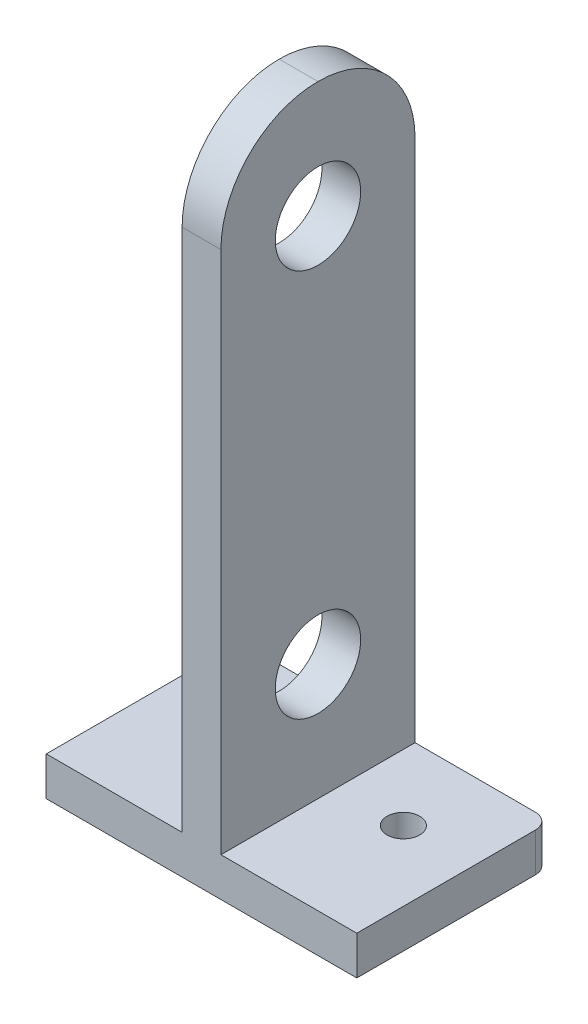
ISO-10303-21;
HEADER;
FILE_DESCRIPTION(('STEP AP214'),'2;1');
FILE_NAME('part.step','',(''),(''),'','','');
FILE_SCHEMA(('AUTOMOTIVE_DESIGN { 1 0 10303 214 1 1 1 1 }'));
ENDSEC;
DATA;
#1=APPLICATION_CONTEXT('core data for automotive mechanical design processes');
#2=APPLICATION_PROTOCOL_DEFINITION('international standard','automotive_design',2000,#1);
#3=PRODUCT_CONTEXT('',#1,'mechanical');
#4=PRODUCT('Part','Part','',(#3));
#5=PRODUCT_RELATED_PRODUCT_CATEGORY('part','',(#4));
#6=PRODUCT_DEFINITION_FORMATION('','',#4);
#7=PRODUCT_DEFINITION_CONTEXT('part definition',#1,'design');
#8=PRODUCT_DEFINITION('design','',#6,#7);
#9=PRODUCT_DEFINITION_SHAPE('','',#8);
#10=(LENGTH_UNIT() NAMED_UNIT(*) SI_UNIT(.MILLI.,.METRE.));
#11=(NAMED_UNIT(*) PLANE_ANGLE_UNIT() SI_UNIT($,.RADIAN.));
#12=(NAMED_UNIT(*) SI_UNIT($,.STERADIAN.) SOLID_ANGLE_UNIT());
#13=UNCERTAINTY_MEASURE_WITH_UNIT(LENGTH_MEASURE(1.E-05),#10,'distance_accuracy_value','');
#14=(GEOMETRIC_REPRESENTATION_CONTEXT(3) GLOBAL_UNCERTAINTY_ASSIGNED_CONTEXT((#13)) GLOBAL_UNIT_ASSIGNED_CONTEXT((#10,
#11,#12)) REPRESENTATION_CONTEXT('',''));
#15=CARTESIAN_POINT('',(0.,0.,0.));
#16=DIRECTION('',(0.,0.,1.));
#17=DIRECTION('',(1.,0.,0.));
#18=AXIS2_PLACEMENT_3D('',#15,#16,#17);
#19=CARTESIAN_POINT('',(0.,5.,0.));
#20=DIRECTION('',(0.,1.,0.));
#21=DIRECTION('',(0.,0.,1.));
#22=AXIS2_PLACEMENT_3D('',#19,#20,#21);
#23=PLANE('',#22);
#24=CARTESIAN_POINT('',(9.,5.,10.));
#25=DIRECTION('',(0.,1.,0.));
#26=DIRECTION('',(0.,0.,1.));
#27=AXIS2_PLACEMENT_3D('',#24,#25,#26);
#28=CIRCLE('',#27,2.1);
#29=CARTESIAN_POINT('',(9.,5.,12.1));
#30=VERTEX_POINT('',#29);
#31=EDGE_CURVE('E297',#30,#30,#28,.T.);
#32=ORIENTED_EDGE('',*,*,#31,.F.);
#33=EDGE_LOOP('',(#32));
#34=FACE_BOUND('',#33,.T.);
#35=DIRECTION('',(-1.,0.,0.));
#36=VECTOR('',#35,1.);
#37=CARTESIAN_POINT('',(0.,5.,0.));
#38=LINE('',#37,#36);
#39=CARTESIAN_POINT('',(17.5,5.,0.));
#40=VERTEX_POINT('',#39);
#41=CARTESIAN_POINT('',(2.,5.,0.));
#42=VERTEX_POINT('',#41);
#43=EDGE_CURVE('E144',#40,#42,#38,.T.);
#44=ORIENTED_EDGE('',*,*,#43,.T.);
#45=CARTESIAN_POINT('',(2.,5.,2.));
#46=DIRECTION('',(0.,1.,0.));
#47=DIRECTION('',(0.,0.,1.));
#48=AXIS2_PLACEMENT_3D('',#45,#46,#47);
#49=CIRCLE('',#48,2.);
#50=CARTESIAN_POINT('',(0.,5.,2.));
#51=VERTEX_POINT('',#50);
#52=EDGE_CURVE('E251',#42,#51,#49,.T.);
#53=ORIENTED_EDGE('',*,*,#52,.T.);
#54=DIRECTION('',(0.,0.,1.));
#55=VECTOR('',#54,1.);
#56=CARTESIAN_POINT('',(0.,5.,0.));
#57=LINE('',#56,#55);
#58=CARTESIAN_POINT('',(0.,5.,25.));
#59=VERTEX_POINT('',#58);
#60=EDGE_CURVE('E177',#51,#59,#57,.T.);
#61=ORIENTED_EDGE('',*,*,#60,.T.);
#62=DIRECTION('',(1.,0.,0.));
#63=VECTOR('',#62,1.);
#64=CARTESIAN_POINT('',(0.,5.,25.));
#65=LINE('',#64,#63);
#66=CARTESIAN_POINT('',(17.5,5.,25.));
#67=VERTEX_POINT('',#66);
#68=EDGE_CURVE('E182',#59,#67,#65,.T.);
#69=ORIENTED_EDGE('',*,*,#68,.T.);
#70=DIRECTION('',(0.,0.,1.));
#71=VECTOR('',#70,1.);
#72=CARTESIAN_POINT('',(17.5,5.,0.));
#73=LINE('',#72,#71);
#74=EDGE_CURVE('E161',#40,#67,#73,.T.);
#75=ORIENTED_EDGE('',*,*,#74,.F.);
#76=EDGE_LOOP('',(#44,#53,#61,#69,#75));
#77=FACE_BOUND('',#76,.T.);
#78=ADVANCED_FACE('F47',(#34,#77),#23,.T.);
#79=CARTESIAN_POINT('',(0.,5.,0.));
#80=DIRECTION('',(1.,0.,0.));
#81=DIRECTION('',(0.,0.,-1.));
#82=AXIS2_PLACEMENT_3D('',#79,#80,#81);
#83=PLANE('',#82);
#84=ORIENTED_EDGE('',*,*,#60,.F.);
#85=DIRECTION('',(0.,-1.,0.));
#86=VECTOR('',#85,1.);
#87=CARTESIAN_POINT('',(0.,5.,2.));
#88=LINE('',#87,#86);
#89=CARTESIAN_POINT('',(0.,0.,2.));
#90=VERTEX_POINT('',#89);
#91=EDGE_CURVE('E231',#51,#90,#88,.T.);
#92=ORIENTED_EDGE('',*,*,#91,.T.);
#93=DIRECTION('',(0.,0.,1.));
#94=VECTOR('',#93,1.);
#95=CARTESIAN_POINT('',(0.,0.,0.));
#96=LINE('',#95,#94);
#97=CARTESIAN_POINT('',(0.,0.,25.));
#98=VERTEX_POINT('',#97);
#99=EDGE_CURVE('E176',#90,#98,#96,.T.);
#100=ORIENTED_EDGE('',*,*,#99,.T.);
#101=DIRECTION('',(0.,-1.,0.));
#102=VECTOR('',#101,1.);
#103=CARTESIAN_POINT('',(0.,5.,25.));
#104=LINE('',#103,#102);
#105=EDGE_CURVE('E202',#59,#98,#104,.T.);
#106=ORIENTED_EDGE('',*,*,#105,.F.);
#107=EDGE_LOOP('',(#84,#92,#100,#106));
#108=FACE_BOUND('',#107,.T.);
#109=ADVANCED_FACE('F270',(#108),#83,.F.);
#110=CARTESIAN_POINT('',(0.,5.,25.));
#111=DIRECTION('',(0.,0.,-1.));
#112=DIRECTION('',(-1.,0.,0.));
#113=AXIS2_PLACEMENT_3D('',#110,#111,#112);
#114=PLANE('',#113);
#115=DIRECTION('',(0.,-1.,0.));
#116=VECTOR('',#115,1.);
#117=CARTESIAN_POINT('',(22.5,85.,25.));
#118=LINE('',#117,#116);
#119=CARTESIAN_POINT('',(22.5,72.5,25.));
#120=VERTEX_POINT('',#119);
#121=CARTESIAN_POINT('',(22.5,5.,25.));
#122=VERTEX_POINT('',#121);
#123=EDGE_CURVE('E155',#120,#122,#118,.T.);
#124=ORIENTED_EDGE('',*,*,#123,.F.);
#125=DIRECTION('',(1.,0.,0.));
#126=VECTOR('',#125,1.);
#127=CARTESIAN_POINT('',(17.5,72.5,25.));
#128=LINE('',#127,#126);
#129=CARTESIAN_POINT('',(17.5,72.5,25.));
#130=VERTEX_POINT('',#129);
#131=EDGE_CURVE('E228',#120,#130,#128,.F.);
#132=ORIENTED_EDGE('',*,*,#131,.T.);
#133=DIRECTION('',(0.,-1.,0.));
#134=VECTOR('',#133,1.);
#135=CARTESIAN_POINT('',(17.5,85.,25.));
#136=LINE('',#135,#134);
#137=EDGE_CURVE('E173',#130,#67,#136,.T.);
#138=ORIENTED_EDGE('',*,*,#137,.T.);
#139=ORIENTED_EDGE('',*,*,#68,.F.);
#140=ORIENTED_EDGE('',*,*,#105,.T.);
#141=DIRECTION('',(1.,0.,0.));
#142=VECTOR('',#141,1.);
#143=CARTESIAN_POINT('',(0.,0.,25.));
#144=LINE('',#143,#142);
#145=CARTESIAN_POINT('',(40.,0.,25.));
#146=VERTEX_POINT('',#145);
#147=EDGE_CURVE('E191',#98,#146,#144,.T.);
#148=ORIENTED_EDGE('',*,*,#147,.T.);
#149=DIRECTION('',(0.,-1.,0.));
#150=VECTOR('',#149,1.);
#151=CARTESIAN_POINT('',(40.,5.,25.));
#152=LINE('',#151,#150);
#153=CARTESIAN_POINT('',(40.,5.,25.));
#154=VERTEX_POINT('',#153);
#155=EDGE_CURVE('E143',#154,#146,#152,.T.);
#156=ORIENTED_EDGE('',*,*,#155,.F.);
#157=EDGE_CURVE('E180',#122,#154,#65,.T.);
#158=ORIENTED_EDGE('',*,*,#157,.F.);
#159=EDGE_LOOP('',(#124,#132,#138,#139,#140,#148,#156,#158));
#160=FACE_BOUND('',#159,.T.);
#161=ADVANCED_FACE('F258',(#160),#114,.F.);
#162=CARTESIAN_POINT('',(40.,5.,0.));
#163=DIRECTION('',(-1.,0.,0.));
#164=DIRECTION('',(0.,0.,1.));
#165=AXIS2_PLACEMENT_3D('',#162,#163,#164);
#166=PLANE('',#165);
#167=DIRECTION('',(0.,0.,-1.));
#168=VECTOR('',#167,1.);
#169=CARTESIAN_POINT('',(40.,0.,0.));
#170=LINE('',#169,#168);
#171=CARTESIAN_POINT('',(40.,0.,2.));
#172=VERTEX_POINT('',#171);
#173=EDGE_CURVE('E194',#146,#172,#170,.T.);
#174=ORIENTED_EDGE('',*,*,#173,.T.);
#175=DIRECTION('',(0.,-1.,0.));
#176=VECTOR('',#175,1.);
#177=CARTESIAN_POINT('',(40.,5.,2.));
#178=LINE('',#177,#176);
#179=CARTESIAN_POINT('',(40.,5.,2.));
#180=VERTEX_POINT('',#179);
#181=EDGE_CURVE('E56',#172,#180,#178,.F.);
#182=ORIENTED_EDGE('',*,*,#181,.T.);
#183=DIRECTION('',(0.,0.,-1.));
#184=VECTOR('',#183,1.);
#185=CARTESIAN_POINT('',(40.,5.,0.));
#186=LINE('',#185,#184);
#187=EDGE_CURVE('E186',#154,#180,#186,.T.);
#188=ORIENTED_EDGE('',*,*,#187,.F.);
#189=ORIENTED_EDGE('',*,*,#155,.T.);
#190=EDGE_LOOP('',(#174,#182,#188,#189));
#191=FACE_BOUND('',#190,.T.);
#192=ADVANCED_FACE('F261',(#191),#166,.F.);
#193=CARTESIAN_POINT('',(0.,5.,0.));
#194=DIRECTION('',(0.,0.,1.));
#195=DIRECTION('',(1.,0.,0.));
#196=AXIS2_PLACEMENT_3D('',#193,#194,#195);
#197=PLANE('',#196);
#198=DIRECTION('',(-1.,0.,0.));
#199=VECTOR('',#198,1.);
#200=CARTESIAN_POINT('',(0.,0.,0.));
#201=LINE('',#200,#199);
#202=CARTESIAN_POINT('',(38.,0.,0.));
#203=VERTEX_POINT('',#202);
#204=CARTESIAN_POINT('',(2.,0.,0.));
#205=VERTEX_POINT('',#204);
#206=EDGE_CURVE('E181',#203,#205,#201,.T.);
#207=ORIENTED_EDGE('',*,*,#206,.T.);
#208=DIRECTION('',(0.,-1.,0.));
#209=VECTOR('',#208,1.);
#210=CARTESIAN_POINT('',(2.,5.,0.));
#211=LINE('',#210,#209);
#212=EDGE_CURVE('E70',#205,#42,#211,.F.);
#213=ORIENTED_EDGE('',*,*,#212,.T.);
#214=ORIENTED_EDGE('',*,*,#43,.F.);
#215=DIRECTION('',(0.,-1.,0.));
#216=VECTOR('',#215,1.);
#217=CARTESIAN_POINT('',(17.5,85.,0.));
#218=LINE('',#217,#216);
#219=CARTESIAN_POINT('',(17.5,72.5,0.));
#220=VERTEX_POINT('',#219);
#221=EDGE_CURVE('E156',#220,#40,#218,.T.);
#222=ORIENTED_EDGE('',*,*,#221,.F.);
#223=DIRECTION('',(-1.,0.,0.));
#224=VECTOR('',#223,1.);
#225=CARTESIAN_POINT('',(22.5,72.5,0.));
#226=LINE('',#225,#224);
#227=CARTESIAN_POINT('',(22.5,72.5,0.));
#228=VERTEX_POINT('',#227);
#229=EDGE_CURVE('E152',#220,#228,#226,.F.);
#230=ORIENTED_EDGE('',*,*,#229,.T.);
#231=DIRECTION('',(0.,-1.,0.));
#232=VECTOR('',#231,1.);
#233=CARTESIAN_POINT('',(22.5,85.,0.));
#234=LINE('',#233,#232);
#235=CARTESIAN_POINT('',(22.5,5.,0.));
#236=VERTEX_POINT('',#235);
#237=EDGE_CURVE('E148',#228,#236,#234,.T.);
#238=ORIENTED_EDGE('',*,*,#237,.T.);
#239=CARTESIAN_POINT('',(38.,5.,0.));
#240=VERTEX_POINT('',#239);
#241=EDGE_CURVE('E133',#240,#236,#38,.T.);
#242=ORIENTED_EDGE('',*,*,#241,.F.);
#243=DIRECTION('',(0.,-1.,0.));
#244=VECTOR('',#243,1.);
#245=CARTESIAN_POINT('',(38.,5.,0.));
#246=LINE('',#245,#244);
#247=EDGE_CURVE('E246',#240,#203,#246,.T.);
#248=ORIENTED_EDGE('',*,*,#247,.T.);
#249=EDGE_LOOP('',(#207,#213,#214,#222,#230,#238,#242,#248));
#250=FACE_BOUND('',#249,.T.);
#251=ADVANCED_FACE('F149',(#250),#197,.F.);
#252=CARTESIAN_POINT('',(31.,5.,10.));
#253=DIRECTION('',(0.,1.,0.));
#254=DIRECTION('',(0.,0.,1.));
#255=AXIS2_PLACEMENT_3D('',#252,#253,#254);
#256=CIRCLE('',#255,2.1);
#257=CARTESIAN_POINT('',(31.,5.,12.1));
#258=VERTEX_POINT('',#257);
#259=EDGE_CURVE('E294',#258,#258,#256,.T.);
#260=ORIENTED_EDGE('',*,*,#259,.F.);
#261=EDGE_LOOP('',(#260));
#262=FACE_BOUND('',#261,.T.);
#263=ORIENTED_EDGE('',*,*,#187,.T.);
#264=CARTESIAN_POINT('',(38.,5.,2.));
#265=DIRECTION('',(0.,1.,0.));
#266=DIRECTION('',(0.,0.,1.));
#267=AXIS2_PLACEMENT_3D('',#264,#265,#266);
#268=CIRCLE('',#267,2.);
#269=EDGE_CURVE('E11',#180,#240,#268,.T.);
#270=ORIENTED_EDGE('',*,*,#269,.T.);
#271=ORIENTED_EDGE('',*,*,#241,.T.);
#272=DIRECTION('',(0.,0.,-1.));
#273=VECTOR('',#272,1.);
#274=CARTESIAN_POINT('',(22.5,5.,0.));
#275=LINE('',#274,#273);
#276=EDGE_CURVE('E137',#122,#236,#275,.T.);
#277=ORIENTED_EDGE('',*,*,#276,.F.);
#278=ORIENTED_EDGE('',*,*,#157,.T.);
#279=EDGE_LOOP('',(#263,#270,#271,#277,#278));
#280=FACE_BOUND('',#279,.T.);
#281=ADVANCED_FACE('F135',(#262,#280),#23,.T.);
#282=CARTESIAN_POINT('',(0.,0.,0.));
#283=DIRECTION('',(0.,1.,0.));
#284=DIRECTION('',(0.,0.,1.));
#285=AXIS2_PLACEMENT_3D('',#282,#283,#284);
#286=PLANE('',#285);
#287=CARTESIAN_POINT('',(9.,0.,10.));
#288=DIRECTION('',(0.,1.,0.));
#289=DIRECTION('',(0.,0.,1.));
#290=AXIS2_PLACEMENT_3D('',#287,#288,#289);
#291=CIRCLE('',#290,2.1);
#292=CARTESIAN_POINT('',(9.,0.,12.1));
#293=VERTEX_POINT('',#292);
#294=EDGE_CURVE('E302',#293,#293,#291,.T.);
#295=ORIENTED_EDGE('',*,*,#294,.T.);
#296=EDGE_LOOP('',(#295));
#297=FACE_BOUND('',#296,.T.);
#298=CARTESIAN_POINT('',(31.,0.,10.));
#299=DIRECTION('',(0.,1.,0.));
#300=DIRECTION('',(0.,0.,1.));
#301=AXIS2_PLACEMENT_3D('',#298,#299,#300);
#302=CIRCLE('',#301,2.1);
#303=CARTESIAN_POINT('',(31.,0.,12.1));
#304=VERTEX_POINT('',#303);
#305=EDGE_CURVE('E236',#304,#304,#302,.T.);
#306=ORIENTED_EDGE('',*,*,#305,.T.);
#307=EDGE_LOOP('',(#306));
#308=FACE_BOUND('',#307,.T.);
#309=ORIENTED_EDGE('',*,*,#99,.F.);
#310=CARTESIAN_POINT('',(2.,0.,2.));
#311=DIRECTION('',(0.,1.,0.));
#312=DIRECTION('',(0.,0.,1.));
#313=AXIS2_PLACEMENT_3D('',#310,#311,#312);
#314=CIRCLE('',#313,2.);
#315=EDGE_CURVE('E243',#90,#205,#314,.F.);
#316=ORIENTED_EDGE('',*,*,#315,.T.);
#317=ORIENTED_EDGE('',*,*,#206,.F.);
#318=CARTESIAN_POINT('',(38.,0.,2.));
#319=DIRECTION('',(0.,1.,0.));
#320=DIRECTION('',(0.,0.,1.));
#321=AXIS2_PLACEMENT_3D('',#318,#319,#320);
#322=CIRCLE('',#321,2.);
#323=EDGE_CURVE('E240',#203,#172,#322,.F.);
#324=ORIENTED_EDGE('',*,*,#323,.T.);
#325=ORIENTED_EDGE('',*,*,#173,.F.);
#326=ORIENTED_EDGE('',*,*,#147,.F.);
#327=EDGE_LOOP('',(#309,#316,#317,#324,#325,#326));
#328=FACE_BOUND('',#327,.T.);
#329=ADVANCED_FACE('F285',(#297,#308,#328),#286,.F.);
#330=CARTESIAN_POINT('',(17.5,85.,0.));
#331=DIRECTION('',(1.,0.,0.));
#332=DIRECTION('',(0.,0.,-1.));
#333=AXIS2_PLACEMENT_3D('',#330,#331,#332);
#334=PLANE('',#333);
#335=CARTESIAN_POINT('',(17.5,70.,12.5));
#336=DIRECTION('',(-1.,0.,0.));
#337=DIRECTION('',(0.,0.,1.));
#338=AXIS2_PLACEMENT_3D('',#335,#336,#337);
#339=CIRCLE('',#338,5.5);
#340=CARTESIAN_POINT('',(17.5,70.,18.));
#341=VERTEX_POINT('',#340);
#342=EDGE_CURVE('E211',#341,#341,#339,.T.);
#343=ORIENTED_EDGE('',*,*,#342,.F.);
#344=EDGE_LOOP('',(#343));
#345=FACE_BOUND('',#344,.T.);
#346=CARTESIAN_POINT('',(17.5,20.,12.5));
#347=DIRECTION('',(-1.,0.,0.));
#348=DIRECTION('',(0.,0.,1.));
#349=AXIS2_PLACEMENT_3D('',#346,#347,#348);
#350=CIRCLE('',#349,5.5);
#351=CARTESIAN_POINT('',(17.5,20.,18.));
#352=VERTEX_POINT('',#351);
#353=EDGE_CURVE('E310',#352,#352,#350,.T.);
#354=ORIENTED_EDGE('',*,*,#353,.F.);
#355=EDGE_LOOP('',(#354));
#356=FACE_BOUND('',#355,.T.);
#357=CARTESIAN_POINT('',(17.5,72.5,12.5));
#358=DIRECTION('',(1.,0.,0.));
#359=DIRECTION('',(0.,0.,-1.));
#360=AXIS2_PLACEMENT_3D('',#357,#358,#359);
#361=CIRCLE('',#360,12.5);
#362=CARTESIAN_POINT('',(17.5,85.,12.5));
#363=VERTEX_POINT('',#362);
#364=EDGE_CURVE('E206',#130,#363,#361,.F.);
#365=ORIENTED_EDGE('',*,*,#364,.T.);
#366=CARTESIAN_POINT('',(17.5,72.5,12.5));
#367=DIRECTION('',(1.,0.,0.));
#368=DIRECTION('',(0.,0.,-1.));
#369=AXIS2_PLACEMENT_3D('',#366,#367,#368);
#370=CIRCLE('',#369,12.5);
#371=EDGE_CURVE('E217',#363,#220,#370,.F.);
#372=ORIENTED_EDGE('',*,*,#371,.T.);
#373=ORIENTED_EDGE('',*,*,#221,.T.);
#374=ORIENTED_EDGE('',*,*,#74,.T.);
#375=ORIENTED_EDGE('',*,*,#137,.F.);
#376=EDGE_LOOP('',(#365,#372,#373,#374,#375));
#377=FACE_BOUND('',#376,.T.);
#378=ADVANCED_FACE('F290',(#345,#356,#377),#334,.F.);
#379=CARTESIAN_POINT('',(22.5,85.,0.));
#380=DIRECTION('',(-1.,0.,0.));
#381=DIRECTION('',(0.,0.,1.));
#382=AXIS2_PLACEMENT_3D('',#379,#380,#381);
#383=PLANE('',#382);
#384=CARTESIAN_POINT('',(22.5,70.,12.5));
#385=DIRECTION('',(-1.,0.,0.));
#386=DIRECTION('',(0.,0.,1.));
#387=AXIS2_PLACEMENT_3D('',#384,#385,#386);
#388=CIRCLE('',#387,5.5);
#389=CARTESIAN_POINT('',(22.5,70.,18.));
#390=VERTEX_POINT('',#389);
#391=EDGE_CURVE('E167',#390,#390,#388,.T.);
#392=ORIENTED_EDGE('',*,*,#391,.T.);
#393=EDGE_LOOP('',(#392));
#394=FACE_BOUND('',#393,.T.);
#395=CARTESIAN_POINT('',(22.5,20.,12.5));
#396=DIRECTION('',(-1.,0.,0.));
#397=DIRECTION('',(0.,0.,1.));
#398=AXIS2_PLACEMENT_3D('',#395,#396,#397);
#399=CIRCLE('',#398,5.5);
#400=CARTESIAN_POINT('',(22.5,20.,18.));
#401=VERTEX_POINT('',#400);
#402=EDGE_CURVE('E207',#401,#401,#399,.T.);
#403=ORIENTED_EDGE('',*,*,#402,.T.);
#404=EDGE_LOOP('',(#403));
#405=FACE_BOUND('',#404,.T.);
#406=ORIENTED_EDGE('',*,*,#237,.F.);
#407=CARTESIAN_POINT('',(22.5,72.5,12.5));
#408=DIRECTION('',(-1.,0.,0.));
#409=DIRECTION('',(0.,0.,1.));
#410=AXIS2_PLACEMENT_3D('',#407,#408,#409);
#411=CIRCLE('',#410,12.5);
#412=CARTESIAN_POINT('',(22.5,85.,12.5));
#413=VERTEX_POINT('',#412);
#414=EDGE_CURVE('E225',#228,#413,#411,.F.);
#415=ORIENTED_EDGE('',*,*,#414,.T.);
#416=CARTESIAN_POINT('',(22.5,72.5,12.5));
#417=DIRECTION('',(-1.,0.,0.));
#418=DIRECTION('',(0.,0.,1.));
#419=AXIS2_PLACEMENT_3D('',#416,#417,#418);
#420=CIRCLE('',#419,12.5);
#421=EDGE_CURVE('E222',#413,#120,#420,.F.);
#422=ORIENTED_EDGE('',*,*,#421,.T.);
#423=ORIENTED_EDGE('',*,*,#123,.T.);
#424=ORIENTED_EDGE('',*,*,#276,.T.);
#425=EDGE_LOOP('',(#406,#415,#422,#423,#424));
#426=FACE_BOUND('',#425,.T.);
#427=ADVANCED_FACE('F158',(#394,#405,#426),#383,.F.);
#428=CARTESIAN_POINT('',(40.,20.,12.5));
#429=DIRECTION('',(-1.,0.,0.));
#430=DIRECTION('',(0.,0.,1.));
#431=AXIS2_PLACEMENT_3D('',#428,#429,#430);
#432=CYLINDRICAL_SURFACE('',#431,5.5);
#433=CARTESIAN_POINT('',(17.5,20.,18.));
#434=CARTESIAN_POINT('',(17.5520833333333,20.,18.));
#435=CARTESIAN_POINT('',(17.6041666666667,20.,18.));
#436=CARTESIAN_POINT('',(17.7083333333333,20.,18.));
#437=CARTESIAN_POINT('',(17.7604166666667,20.,18.));
#438=CARTESIAN_POINT('',(17.8645833333333,20.,18.));
#439=CARTESIAN_POINT('',(17.9166666666667,20.,18.));
#440=CARTESIAN_POINT('',(18.0208333333333,20.,18.));
#441=CARTESIAN_POINT('',(18.0729166666667,20.,18.));
#442=CARTESIAN_POINT('',(18.1770833333333,20.,18.));
#443=CARTESIAN_POINT('',(18.2291666666667,20.,18.));
#444=CARTESIAN_POINT('',(18.3333333333333,20.,18.));
#445=CARTESIAN_POINT('',(18.3854166666667,20.,18.));
#446=CARTESIAN_POINT('',(18.4895833333333,20.,18.));
#447=CARTESIAN_POINT('',(18.5416666666667,20.,18.));
#448=CARTESIAN_POINT('',(18.6458333333333,20.,18.));
#449=CARTESIAN_POINT('',(18.6979166666667,20.,18.));
#450=CARTESIAN_POINT('',(18.8020833333333,20.,18.));
#451=CARTESIAN_POINT('',(18.8541666666667,20.,18.));
#452=CARTESIAN_POINT('',(18.9583333333333,20.,18.));
#453=CARTESIAN_POINT('',(19.0104166666667,20.,18.));
#454=CARTESIAN_POINT('',(19.1145833333333,20.,18.));
#455=CARTESIAN_POINT('',(19.1666666666667,20.,18.));
#456=CARTESIAN_POINT('',(19.2708333333333,20.,18.));
#457=CARTESIAN_POINT('',(19.3229166666667,20.,18.));
#458=CARTESIAN_POINT('',(19.4270833333333,20.,18.));
#459=CARTESIAN_POINT('',(19.4791666666667,20.,18.));
#460=CARTESIAN_POINT('',(19.5833333333333,20.,18.));
#461=CARTESIAN_POINT('',(19.6354166666667,20.,18.));
#462=CARTESIAN_POINT('',(19.7395833333333,20.,18.));
#463=CARTESIAN_POINT('',(19.7916666666667,20.,18.));
#464=CARTESIAN_POINT('',(19.8958333333333,20.,18.));
#465=CARTESIAN_POINT('',(19.9479166666667,20.,18.));
#466=CARTESIAN_POINT('',(20.0520833333333,20.,18.));
#467=CARTESIAN_POINT('',(20.1041666666667,20.,18.));
#468=CARTESIAN_POINT('',(20.2083333333333,20.,18.));
#469=CARTESIAN_POINT('',(20.2604166666667,20.,18.));
#470=CARTESIAN_POINT('',(20.3645833333333,20.,18.));
#471=CARTESIAN_POINT('',(20.4166666666667,20.,18.));
#472=CARTESIAN_POINT('',(20.5208333333333,20.,18.));
#473=CARTESIAN_POINT('',(20.5729166666667,20.,18.));
#474=CARTESIAN_POINT('',(20.6770833333333,20.,18.));
#475=CARTESIAN_POINT('',(20.7291666666667,20.,18.));
#476=CARTESIAN_POINT('',(20.8333333333333,20.,18.));
#477=CARTESIAN_POINT('',(20.8854166666667,20.,18.));
#478=CARTESIAN_POINT('',(20.9895833333333,20.,18.));
#479=CARTESIAN_POINT('',(21.0416666666667,20.,18.));
#480=CARTESIAN_POINT('',(21.1458333333333,20.,18.));
#481=CARTESIAN_POINT('',(21.1979166666667,20.,18.));
#482=CARTESIAN_POINT('',(21.3020833333333,20.,18.));
#483=CARTESIAN_POINT('',(21.3541666666667,20.,18.));
#484=CARTESIAN_POINT('',(21.4583333333333,20.,18.));
#485=CARTESIAN_POINT('',(21.5104166666667,20.,18.));
#486=CARTESIAN_POINT('',(21.6145833333333,20.,18.));
#487=CARTESIAN_POINT('',(21.6666666666667,20.,18.));
#488=CARTESIAN_POINT('',(21.7708333333333,20.,18.));
#489=CARTESIAN_POINT('',(21.8229166666667,20.,18.));
#490=CARTESIAN_POINT('',(21.9270833333333,20.,18.));
#491=CARTESIAN_POINT('',(21.9791666666667,20.,18.));
#492=CARTESIAN_POINT('',(22.0833333333333,20.,18.));
#493=CARTESIAN_POINT('',(22.1354166666667,20.,18.));
#494=CARTESIAN_POINT('',(22.2395833333333,20.,18.));
#495=CARTESIAN_POINT('',(22.2916666666667,20.,18.));
#496=CARTESIAN_POINT('',(22.3958333333333,20.,18.));
#497=CARTESIAN_POINT('',(22.4479166666667,20.,18.));
#498=CARTESIAN_POINT('',(22.5,20.,18.));
#499=B_SPLINE_CURVE_WITH_KNOTS('',3,(#433,#434,#435,#436,#437,#438,#439,#440,#441,#442,#443,
#444,#445,#446,#447,#448,#449,#450,#451,#452,#453,#454,#455,#456,#457,#458,#459,#460,#461,#462,
#463,#464,#465,#466,#467,#468,#469,#470,#471,#472,#473,#474,#475,#476,#477,#478,#479,#480,#481,
#482,#483,#484,#485,#486,#487,#488,#489,#490,#491,#492,#493,#494,#495,#496,#497,#498),
.UNSPECIFIED.,.F.,.F.,(4,2,2,2,2,2,2,2,2,2,2,2,2,2,2,2,2,2,2,2,2,2,2,2,2,2,2,2,2,2,2,2,4),(0.,
0.15625,0.3125,0.46875,0.625000000000001,0.781250000000001,0.937500000000001,1.09375,1.25,
1.40625,1.5625,1.71875,1.875,2.03125,2.1875,2.34375,2.5,2.65625,2.8125,2.96875,3.125,3.28125,
3.4375,3.59375,3.75,3.90625,4.0625,4.21875,4.375,4.53125,4.6875,4.84375,5.),.UNSPECIFIED.);
#500=EDGE_CURVE('BSEAM339',#352,#401,#499,.T.);
#501=ORIENTED_EDGE('',*,*,#353,.T.);
#502=ORIENTED_EDGE('',*,*,#402,.F.);
#503=ORIENTED_EDGE('',*,*,#500,.T.);
#504=ORIENTED_EDGE('',*,*,#500,.F.);
#505=EDGE_LOOP('',(#501,#503,#502,#504));
#506=FACE_BOUND('',#505,.T.);
#507=ADVANCED_FACE('F339',(#506),#432,.F.);
#508=CARTESIAN_POINT('',(40.,70.,12.5));
#509=DIRECTION('',(-1.,0.,0.));
#510=DIRECTION('',(0.,0.,1.));
#511=AXIS2_PLACEMENT_3D('',#508,#509,#510);
#512=CYLINDRICAL_SURFACE('',#511,5.5);
#513=CARTESIAN_POINT('',(17.5,70.,18.));
#514=CARTESIAN_POINT('',(17.5520833333333,70.,18.));
#515=CARTESIAN_POINT('',(17.6041666666667,70.,18.));
#516=CARTESIAN_POINT('',(17.7083333333333,70.,18.));
#517=CARTESIAN_POINT('',(17.7604166666667,70.,18.));
#518=CARTESIAN_POINT('',(17.8645833333333,70.,18.));
#519=CARTESIAN_POINT('',(17.9166666666667,70.,18.));
#520=CARTESIAN_POINT('',(18.0208333333333,70.,18.));
#521=CARTESIAN_POINT('',(18.0729166666667,70.,18.));
#522=CARTESIAN_POINT('',(18.1770833333333,70.,18.));
#523=CARTESIAN_POINT('',(18.2291666666667,70.,18.));
#524=CARTESIAN_POINT('',(18.3333333333333,70.,18.));
#525=CARTESIAN_POINT('',(18.3854166666667,70.,18.));
#526=CARTESIAN_POINT('',(18.4895833333333,70.,18.));
#527=CARTESIAN_POINT('',(18.5416666666667,70.,18.));
#528=CARTESIAN_POINT('',(18.6458333333333,70.,18.));
#529=CARTESIAN_POINT('',(18.6979166666667,70.,18.));
#530=CARTESIAN_POINT('',(18.8020833333333,70.,18.));
#531=CARTESIAN_POINT('',(18.8541666666667,70.,18.));
#532=CARTESIAN_POINT('',(18.9583333333333,70.,18.));
#533=CARTESIAN_POINT('',(19.0104166666667,70.,18.));
#534=CARTESIAN_POINT('',(19.1145833333333,70.,18.));
#535=CARTESIAN_POINT('',(19.1666666666667,70.,18.));
#536=CARTESIAN_POINT('',(19.2708333333333,70.,18.));
#537=CARTESIAN_POINT('',(19.3229166666667,70.,18.));
#538=CARTESIAN_POINT('',(19.4270833333333,70.,18.));
#539=CARTESIAN_POINT('',(19.4791666666667,70.,18.));
#540=CARTESIAN_POINT('',(19.5833333333333,70.,18.));
#541=CARTESIAN_POINT('',(19.6354166666667,70.,18.));
#542=CARTESIAN_POINT('',(19.7395833333333,70.,18.));
#543=CARTESIAN_POINT('',(19.7916666666667,70.,18.));
#544=CARTESIAN_POINT('',(19.8958333333333,70.,18.));
#545=CARTESIAN_POINT('',(19.9479166666667,70.,18.));
#546=CARTESIAN_POINT('',(20.0520833333333,70.,18.));
#547=CARTESIAN_POINT('',(20.1041666666667,70.,18.));
#548=CARTESIAN_POINT('',(20.2083333333333,70.,18.));
#549=CARTESIAN_POINT('',(20.2604166666667,70.,18.));
#550=CARTESIAN_POINT('',(20.3645833333333,70.,18.));
#551=CARTESIAN_POINT('',(20.4166666666667,70.,18.));
#552=CARTESIAN_POINT('',(20.5208333333333,70.,18.));
#553=CARTESIAN_POINT('',(20.5729166666667,70.,18.));
#554=CARTESIAN_POINT('',(20.6770833333333,70.,18.));
#555=CARTESIAN_POINT('',(20.7291666666667,70.,18.));
#556=CARTESIAN_POINT('',(20.8333333333333,70.,18.));
#557=CARTESIAN_POINT('',(20.8854166666667,70.,18.));
#558=CARTESIAN_POINT('',(20.9895833333333,70.,18.));
#559=CARTESIAN_POINT('',(21.0416666666667,70.,18.));
#560=CARTESIAN_POINT('',(21.1458333333333,70.,18.));
#561=CARTESIAN_POINT('',(21.1979166666667,70.,18.));
#562=CARTESIAN_POINT('',(21.3020833333333,70.,18.));
#563=CARTESIAN_POINT('',(21.3541666666667,70.,18.));
#564=CARTESIAN_POINT('',(21.4583333333333,70.,18.));
#565=CARTESIAN_POINT('',(21.5104166666667,70.,18.));
#566=CARTESIAN_POINT('',(21.6145833333333,70.,18.));
#567=CARTESIAN_POINT('',(21.6666666666667,70.,18.));
#568=CARTESIAN_POINT('',(21.7708333333333,70.,18.));
#569=CARTESIAN_POINT('',(21.8229166666667,70.,18.));
#570=CARTESIAN_POINT('',(21.9270833333333,70.,18.));
#571=CARTESIAN_POINT('',(21.9791666666667,70.,18.));
#572=CARTESIAN_POINT('',(22.0833333333333,70.,18.));
#573=CARTESIAN_POINT('',(22.1354166666667,70.,18.));
#574=CARTESIAN_POINT('',(22.2395833333333,70.,18.));
#575=CARTESIAN_POINT('',(22.2916666666667,70.,18.));
#576=CARTESIAN_POINT('',(22.3958333333333,70.,18.));
#577=CARTESIAN_POINT('',(22.4479166666667,70.,18.));
#578=CARTESIAN_POINT('',(22.5,70.,18.));
#579=B_SPLINE_CURVE_WITH_KNOTS('',3,(#513,#514,#515,#516,#517,#518,#519,#520,#521,#522,#523,
#524,#525,#526,#527,#528,#529,#530,#531,#532,#533,#534,#535,#536,#537,#538,#539,#540,#541,#542,
#543,#544,#545,#546,#547,#548,#549,#550,#551,#552,#553,#554,#555,#556,#557,#558,#559,#560,#561,
#562,#563,#564,#565,#566,#567,#568,#569,#570,#571,#572,#573,#574,#575,#576,#577,#578),
.UNSPECIFIED.,.F.,.F.,(4,2,2,2,2,2,2,2,2,2,2,2,2,2,2,2,2,2,2,2,2,2,2,2,2,2,2,2,2,2,2,2,4),(0.,
0.15625,0.3125,0.46875,0.625000000000001,0.781250000000001,0.937500000000001,1.09375,1.25,
1.40625,1.5625,1.71875,1.875,2.03125,2.1875,2.34375,2.5,2.65625,2.8125,2.96875,3.125,3.28125,
3.4375,3.59375,3.75,3.90625,4.0625,4.21875,4.375,4.53125,4.6875,4.84375,5.),.UNSPECIFIED.);
#580=EDGE_CURVE('BSEAM333',#341,#390,#579,.T.);
#581=ORIENTED_EDGE('',*,*,#342,.T.);
#582=ORIENTED_EDGE('',*,*,#391,.F.);
#583=ORIENTED_EDGE('',*,*,#580,.T.);
#584=ORIENTED_EDGE('',*,*,#580,.F.);
#585=EDGE_LOOP('',(#581,#583,#582,#584));
#586=FACE_BOUND('',#585,.T.);
#587=ADVANCED_FACE('F333',(#586),#512,.F.);
#588=CARTESIAN_POINT('',(31.,0.,10.));
#589=DIRECTION('',(0.,1.,0.));
#590=DIRECTION('',(0.,0.,1.));
#591=AXIS2_PLACEMENT_3D('',#588,#589,#590);
#592=CYLINDRICAL_SURFACE('',#591,2.1);
#593=ORIENTED_EDGE('',*,*,#305,.F.);
#594=EDGE_LOOP('',(#593));
#595=FACE_BOUND('',#594,.T.);
#596=ORIENTED_EDGE('',*,*,#259,.T.);
#597=EDGE_LOOP('',(#596));
#598=FACE_BOUND('',#597,.T.);
#599=ADVANCED_FACE('F324',(#595,#598),#592,.F.);
#600=CARTESIAN_POINT('',(9.,0.,10.));
#601=DIRECTION('',(0.,1.,0.));
#602=DIRECTION('',(0.,0.,1.));
#603=AXIS2_PLACEMENT_3D('',#600,#601,#602);
#604=CYLINDRICAL_SURFACE('',#603,2.1);
#605=ORIENTED_EDGE('',*,*,#294,.F.);
#606=EDGE_LOOP('',(#605));
#607=FACE_BOUND('',#606,.T.);
#608=ORIENTED_EDGE('',*,*,#31,.T.);
#609=EDGE_LOOP('',(#608));
#610=FACE_BOUND('',#609,.T.);
#611=ADVANCED_FACE('F320',(#607,#610),#604,.F.);
#612=CARTESIAN_POINT('',(0.,72.5,12.5));
#613=DIRECTION('',(-1.,0.,0.));
#614=DIRECTION('',(0.,0.,1.));
#615=AXIS2_PLACEMENT_3D('',#612,#613,#614);
#616=CYLINDRICAL_SURFACE('',#615,12.5);
#617=ORIENTED_EDGE('',*,*,#131,.F.);
#618=ORIENTED_EDGE('',*,*,#421,.F.);
#619=DIRECTION('',(1.,0.,0.));
#620=VECTOR('',#619,1.);
#621=CARTESIAN_POINT('',(22.5,85.,12.5));
#622=LINE('',#621,#620);
#623=EDGE_CURVE('E232',#363,#413,#622,.T.);
#624=ORIENTED_EDGE('',*,*,#623,.F.);
#625=ORIENTED_EDGE('',*,*,#364,.F.);
#626=EDGE_LOOP('',(#617,#618,#624,#625));
#627=FACE_BOUND('',#626,.T.);
#628=ADVANCED_FACE('F323',(#627),#616,.T.);
#629=CARTESIAN_POINT('',(0.,72.5,12.5));
#630=DIRECTION('',(1.,0.,0.));
#631=DIRECTION('',(0.,0.,-1.));
#632=AXIS2_PLACEMENT_3D('',#629,#630,#631);
#633=CYLINDRICAL_SURFACE('',#632,12.5);
#634=ORIENTED_EDGE('',*,*,#414,.F.);
#635=ORIENTED_EDGE('',*,*,#229,.F.);
#636=ORIENTED_EDGE('',*,*,#371,.F.);
#637=ORIENTED_EDGE('',*,*,#623,.T.);
#638=EDGE_LOOP('',(#634,#635,#636,#637));
#639=FACE_BOUND('',#638,.T.);
#640=ADVANCED_FACE('F330',(#639),#633,.T.);
#641=CARTESIAN_POINT('',(2.,5.,2.));
#642=DIRECTION('',(0.,-1.,0.));
#643=DIRECTION('',(0.,0.,-1.));
#644=AXIS2_PLACEMENT_3D('',#641,#642,#643);
#645=CYLINDRICAL_SURFACE('',#644,2.);
#646=ORIENTED_EDGE('',*,*,#52,.F.);
#647=ORIENTED_EDGE('',*,*,#212,.F.);
#648=ORIENTED_EDGE('',*,*,#315,.F.);
#649=ORIENTED_EDGE('',*,*,#91,.F.);
#650=EDGE_LOOP('',(#646,#647,#648,#649));
#651=FACE_BOUND('',#650,.T.);
#652=ADVANCED_FACE('F367',(#651),#645,.T.);
#653=CARTESIAN_POINT('',(38.,5.,2.));
#654=DIRECTION('',(0.,-1.,0.));
#655=DIRECTION('',(0.,0.,-1.));
#656=AXIS2_PLACEMENT_3D('',#653,#654,#655);
#657=CYLINDRICAL_SURFACE('',#656,2.);
#658=ORIENTED_EDGE('',*,*,#269,.F.);
#659=ORIENTED_EDGE('',*,*,#181,.F.);
#660=ORIENTED_EDGE('',*,*,#323,.F.);
#661=ORIENTED_EDGE('',*,*,#247,.F.);
#662=EDGE_LOOP('',(#658,#659,#660,#661));
#663=FACE_BOUND('',#662,.T.);
#664=ADVANCED_FACE('F49',(#663),#657,.T.);
#665=CLOSED_SHELL('',(#78,#109,#161,#192,#251,#281,#329,#378,#427,#507,#587,#599,#611,#628,#640,
#652,#664));
#666=MANIFOLD_SOLID_BREP('B2',#665);
#667=ADVANCED_BREP_SHAPE_REPRESENTATION('',(#18,#666),#14);
#668=SHAPE_DEFINITION_REPRESENTATION(#9,#667);
ENDSEC;
END-ISO-10303-21;
